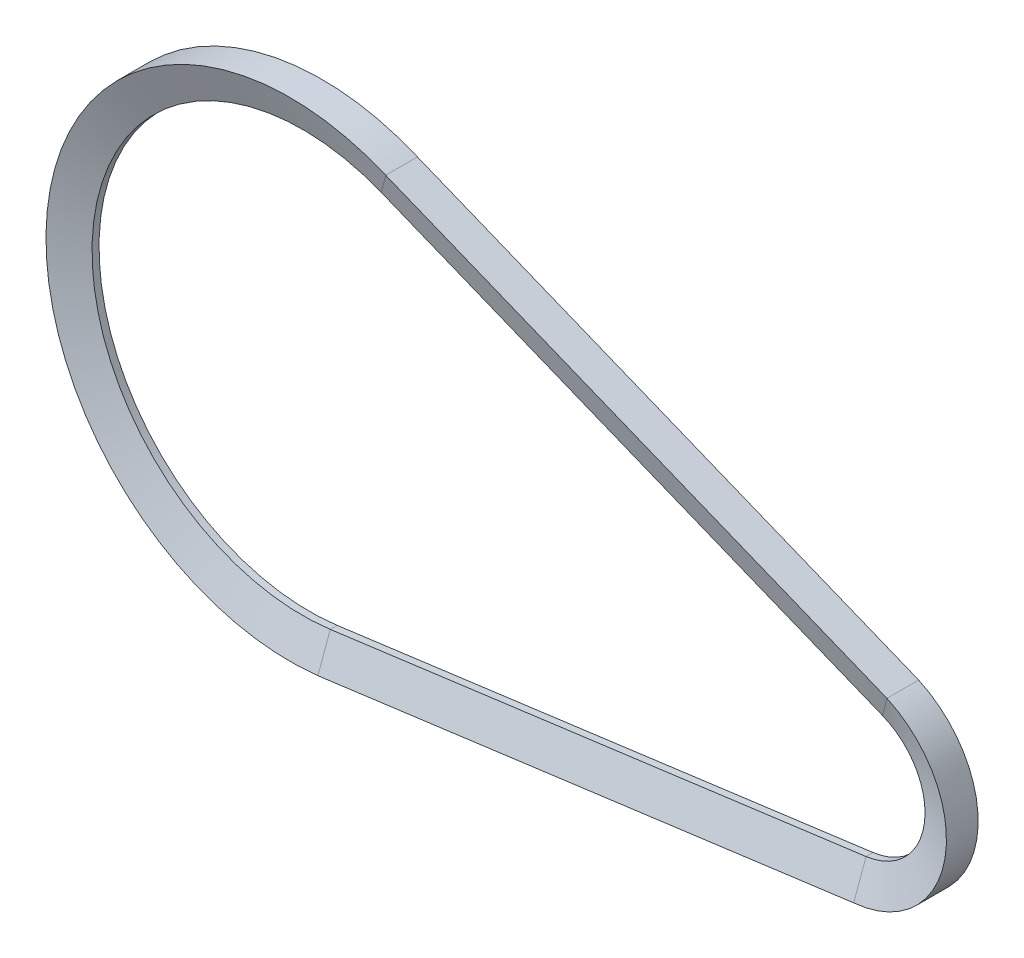
ISO-10303-21;
HEADER;
FILE_DESCRIPTION(('STEP AP214'),'2;1');
FILE_NAME('part.step','',(''),(''),'','','');
FILE_SCHEMA(('AUTOMOTIVE_DESIGN { 1 0 10303 214 1 1 1 1 }'));
ENDSEC;
DATA;
#1=APPLICATION_CONTEXT('core data for automotive mechanical design processes');
#2=APPLICATION_PROTOCOL_DEFINITION('international standard','automotive_design',2000,#1);
#3=PRODUCT_CONTEXT('',#1,'mechanical');
#4=PRODUCT('Part','Part','',(#3));
#5=PRODUCT_RELATED_PRODUCT_CATEGORY('part','',(#4));
#6=PRODUCT_DEFINITION_FORMATION('','',#4);
#7=PRODUCT_DEFINITION_CONTEXT('part definition',#1,'design');
#8=PRODUCT_DEFINITION('design','',#6,#7);
#9=PRODUCT_DEFINITION_SHAPE('','',#8);
#10=(LENGTH_UNIT() NAMED_UNIT(*) SI_UNIT(.MILLI.,.METRE.));
#11=(NAMED_UNIT(*) PLANE_ANGLE_UNIT() SI_UNIT($,.RADIAN.));
#12=(NAMED_UNIT(*) SI_UNIT($,.STERADIAN.) SOLID_ANGLE_UNIT());
#13=UNCERTAINTY_MEASURE_WITH_UNIT(LENGTH_MEASURE(1.E-05),#10,'distance_accuracy_value','');
#14=(GEOMETRIC_REPRESENTATION_CONTEXT(3) GLOBAL_UNCERTAINTY_ASSIGNED_CONTEXT((#13)) GLOBAL_UNIT_ASSIGNED_CONTEXT((#10,
#11,#12)) REPRESENTATION_CONTEXT('',''));
#15=CARTESIAN_POINT('',(0.,0.,0.));
#16=DIRECTION('',(0.,0.,1.));
#17=DIRECTION('',(1.,0.,0.));
#18=AXIS2_PLACEMENT_3D('',#15,#16,#17);
#19=CARTESIAN_POINT('',(124.475719306739,-37.8693151564213,-3.5));
#20=DIRECTION('',(0.131714620449235,-0.991287677094754,0.));
#21=DIRECTION('',(0.991287677094754,0.131714620449235,0.));
#22=AXIS2_PLACEMENT_3D('',#19,#20,#21);
#23=PLANE('',#22);
#24=DIRECTION('',(-0.991287677094754,-0.131714620449235,0.));
#25=VECTOR('',#24,1.);
#26=CARTESIAN_POINT('',(124.475719306739,-37.8693151564213,-3.5));
#27=LINE('',#26,#25);
#28=CARTESIAN_POINT('',(124.475719306739,-37.8693151564213,-3.5));
#29=VERTEX_POINT('',#28);
#30=CARTESIAN_POINT('',(6.12472985088943,-53.5948769849061,-3.5));
#31=VERTEX_POINT('',#30);
#32=EDGE_CURVE('E11',#29,#31,#27,.T.);
#33=ORIENTED_EDGE('',*,*,#32,.F.);
#34=DIRECTION('',(0.,0.,1.));
#35=VECTOR('',#34,1.);
#36=CARTESIAN_POINT('',(124.475719306739,-37.8693151564213,-3.5));
#37=LINE('',#36,#35);
#38=CARTESIAN_POINT('',(124.475719306739,-37.8693151564213,3.5));
#39=VERTEX_POINT('',#38);
#40=EDGE_CURVE('E46',#29,#39,#37,.T.);
#41=ORIENTED_EDGE('',*,*,#40,.T.);
#42=DIRECTION('',(-0.991287677094754,-0.131714620449235,0.));
#43=VECTOR('',#42,1.);
#44=CARTESIAN_POINT('',(124.475719306739,-37.8693151564213,3.5));
#45=LINE('',#44,#43);
#46=CARTESIAN_POINT('',(6.12472985088943,-53.5948769849061,3.5));
#47=VERTEX_POINT('',#46);
#48=EDGE_CURVE('E123',#39,#47,#45,.T.);
#49=ORIENTED_EDGE('',*,*,#48,.T.);
#50=DIRECTION('',(0.,0.,1.));
#51=VECTOR('',#50,1.);
#52=CARTESIAN_POINT('',(6.12472985088944,-53.5948769849061,-3.5));
#53=LINE('',#52,#51);
#54=EDGE_CURVE('E126',#31,#47,#53,.T.);
#55=ORIENTED_EDGE('',*,*,#54,.F.);
#56=EDGE_LOOP('',(#33,#41,#49,#55));
#57=FACE_BOUND('',#56,.T.);
#58=ADVANCED_FACE('F43',(#57),#23,.T.);
#59=CARTESIAN_POINT('',(124.475719306739,-37.8693151564213,-3.5));
#60=DIRECTION('',(-0.0453981297575221,0.341667511459937,-0.938723772697428));
#61=DIRECTION('',(0.,0.939692620785908,0.342020143325669));
#62=AXIS2_PLACEMENT_3D('',#59,#60,#61);
#63=PLANE('',#62);
#64=DIRECTION('',(-0.991287677094754,-0.131714620449235,0.));
#65=VECTOR('',#64,1.);
#66=CARTESIAN_POINT('',(124.475719306739,-30.3693151564213,-0.770223243003475));
#67=LINE('',#66,#65);
#68=CARTESIAN_POINT('',(124.475719306739,-30.3693151564213,-0.770223243003475));
#69=VERTEX_POINT('',#68);
#70=CARTESIAN_POINT('',(6.12472985088944,-46.0948769849061,-0.770223243003475));
#71=VERTEX_POINT('',#70);
#72=EDGE_CURVE('E52',#69,#71,#67,.T.);
#73=ORIENTED_EDGE('',*,*,#72,.F.);
#74=DIRECTION('',(0.,-0.939692620785908,-0.342020143325669));
#75=VECTOR('',#74,1.);
#76=CARTESIAN_POINT('',(124.475719306739,-37.8693151564213,-3.5));
#77=LINE('',#76,#75);
#78=EDGE_CURVE('E216',#69,#29,#77,.T.);
#79=ORIENTED_EDGE('',*,*,#78,.T.);
#80=ORIENTED_EDGE('',*,*,#32,.T.);
#81=DIRECTION('',(0.,-0.939692620785908,-0.342020143325669));
#82=VECTOR('',#81,1.);
#83=CARTESIAN_POINT('',(6.12472985088944,-53.5948769849061,-3.5));
#84=LINE('',#83,#82);
#85=EDGE_CURVE('E153',#71,#31,#84,.T.);
#86=ORIENTED_EDGE('',*,*,#85,.F.);
#87=EDGE_LOOP('',(#73,#79,#80,#86));
#88=FACE_BOUND('',#87,.T.);
#89=ADVANCED_FACE('F265',(#88),#63,.T.);
#90=CARTESIAN_POINT('',(124.475719306739,-30.3693151564213,-0.770223243003475));
#91=DIRECTION('',(-0.131714620449235,0.991287677094754,0.));
#92=DIRECTION('',(-0.991287677094754,-0.131714620449235,0.));
#93=AXIS2_PLACEMENT_3D('',#90,#91,#92);
#94=PLANE('',#93);
#95=DIRECTION('',(-0.991287677094754,-0.131714620449235,0.));
#96=VECTOR('',#95,1.);
#97=CARTESIAN_POINT('',(124.475719306739,-30.3693151564213,0.770223243003475));
#98=LINE('',#97,#96);
#99=CARTESIAN_POINT('',(124.475719306739,-30.3693151564213,0.770223243003475));
#100=VERTEX_POINT('',#99);
#101=CARTESIAN_POINT('',(6.12472985088944,-46.0948769849061,0.770223243003475));
#102=VERTEX_POINT('',#101);
#103=EDGE_CURVE('E133',#100,#102,#98,.T.);
#104=ORIENTED_EDGE('',*,*,#103,.F.);
#105=DIRECTION('',(0.,0.,-1.));
#106=VECTOR('',#105,1.);
#107=CARTESIAN_POINT('',(124.475719306739,-30.3693151564213,-0.770223243003475));
#108=LINE('',#107,#106);
#109=EDGE_CURVE('E189',#100,#69,#108,.T.);
#110=ORIENTED_EDGE('',*,*,#109,.T.);
#111=ORIENTED_EDGE('',*,*,#72,.T.);
#112=DIRECTION('',(0.,0.,-1.));
#113=VECTOR('',#112,1.);
#114=CARTESIAN_POINT('',(6.12472985088944,-46.0948769849061,-0.770223243003475));
#115=LINE('',#114,#113);
#116=EDGE_CURVE('E158',#102,#71,#115,.T.);
#117=ORIENTED_EDGE('',*,*,#116,.F.);
#118=EDGE_LOOP('',(#104,#110,#111,#117));
#119=FACE_BOUND('',#118,.T.);
#120=ADVANCED_FACE('F269',(#119),#94,.T.);
#121=CARTESIAN_POINT('',(122.5,-15.5,0.));
#122=DIRECTION('',(0.,0.,-1.));
#123=DIRECTION('',(-1.,0.,0.));
#124=AXIS2_PLACEMENT_3D('',#121,#122,#123);
#125=CYLINDRICAL_SURFACE('',#124,22.4563961344273);
#126=ORIENTED_EDGE('',*,*,#40,.F.);
#127=CARTESIAN_POINT('',(122.5,-15.5,-3.5));
#128=DIRECTION('',(0.,0.,-1.));
#129=DIRECTION('',(0.414894040337447,0.909869735342631,0.));
#130=AXIS2_PLACEMENT_3D('',#127,#128,#129);
#131=CIRCLE('',#130,22.4563961344273);
#132=CARTESIAN_POINT('',(131.817024923631,4.9323952075806,-3.5));
#133=VERTEX_POINT('',#132);
#134=EDGE_CURVE('E232',#133,#29,#131,.T.);
#135=ORIENTED_EDGE('',*,*,#134,.F.);
#136=DIRECTION('',(0.,0.,1.));
#137=VECTOR('',#136,1.);
#138=CARTESIAN_POINT('',(131.817024923631,4.9323952075806,-3.5));
#139=LINE('',#138,#137);
#140=CARTESIAN_POINT('',(131.817024923631,4.9323952075806,3.5));
#141=VERTEX_POINT('',#140);
#142=EDGE_CURVE('E193',#133,#141,#139,.T.);
#143=ORIENTED_EDGE('',*,*,#142,.T.);
#144=CARTESIAN_POINT('',(122.5,-15.5,3.5));
#145=DIRECTION('',(0.,0.,-1.));
#146=DIRECTION('',(0.414894040337447,0.909869735342631,0.));
#147=AXIS2_PLACEMENT_3D('',#144,#145,#146);
#148=CIRCLE('',#147,22.4563961344273);
#149=EDGE_CURVE('E185',#141,#39,#148,.T.);
#150=ORIENTED_EDGE('',*,*,#149,.T.);
#151=EDGE_LOOP('',(#126,#135,#143,#150));
#152=FACE_BOUND('',#151,.T.);
#153=ADVANCED_FACE('F242',(#152),#125,.T.);
#154=CARTESIAN_POINT('',(128.117006892717,-1.59139713820367,-0.770223243003474));
#155=CARTESIAN_POINT('',(145.926890042233,-8.78394101937952,-0.770223243003474));
#156=CARTESIAN_POINT('',(143.51578882922,-27.8394183480289,-0.770223243003474));
#157=CARTESIAN_POINT('',(124.475719306739,-30.3693151564213,-0.770223243003474));
#158=CARTESIAN_POINT('',(131.817024923631,4.93239520758062,-3.5));
#159=CARTESIAN_POINT('',(157.980585327767,-6.99799973142357,-3.5));
#160=CARTESIAN_POINT('',(153.119494172499,-35.3394183480289,-3.5));
#161=CARTESIAN_POINT('',(124.475719306738,-37.8693151564213,-3.5));
#162=(BOUNDED_SURFACE() B_SPLINE_SURFACE(1,3,((#154,#155,#156,#157),(#158,#159,#160,#161)),
.UNSPECIFIED.,.F.,.F.,.F.) B_SPLINE_SURFACE_WITH_KNOTS((2,2),(4,4),(0.,1.),(0.,1.),
.UNSPECIFIED.) GEOMETRIC_REPRESENTATION_ITEM() RATIONAL_B_SPLINE_SURFACE(((1.,0.503405880312619,
0.503405880312619,1.),(1.,0.503405880312619,0.503405880312619,1.))) REPRESENTATION_ITEM('') SURFACE());
#163=CARTESIAN_POINT('',(122.5,-15.5,-0.770223243003475));
#164=DIRECTION('',(0.,0.,-1.));
#165=DIRECTION('',(0.374467126181138,0.927240190786422,0.));
#166=AXIS2_PLACEMENT_3D('',#163,#164,#165);
#167=CIRCLE('',#166,15.);
#168=CARTESIAN_POINT('',(128.117006892717,-1.59139713820367,-0.770223243003475));
#169=VERTEX_POINT('',#168);
#170=EDGE_CURVE('E212',#169,#69,#167,.T.);
#171=DIRECTION('',(0.463583952056587,0.817381270249743,-0.342020143325669));
#172=VECTOR('',#171,1.);
#173=CARTESIAN_POINT('',(131.817024923631,4.9323952075806,-3.5));
#174=LINE('',#173,#172);
#175=EDGE_CURVE('E206',#169,#133,#174,.T.);
#176=ORIENTED_EDGE('',*,*,#134,.T.);
#177=ORIENTED_EDGE('',*,*,#78,.F.);
#178=ORIENTED_EDGE('',*,*,#170,.F.);
#179=ORIENTED_EDGE('',*,*,#175,.T.);
#180=EDGE_LOOP('',(#176,#177,#178,#179));
#181=FACE_BOUND('',#180,.T.);
#182=ADVANCED_FACE('F278',(#181),#162,.T.);
#183=CARTESIAN_POINT('',(122.5,-15.5,0.));
#184=DIRECTION('',(0.,0.,-1.));
#185=DIRECTION('',(-1.,0.,0.));
#186=AXIS2_PLACEMENT_3D('',#183,#184,#185);
#187=CYLINDRICAL_SURFACE('',#186,15.);
#188=ORIENTED_EDGE('',*,*,#170,.T.);
#189=ORIENTED_EDGE('',*,*,#109,.F.);
#190=CARTESIAN_POINT('',(122.5,-15.5,0.770223243003475));
#191=DIRECTION('',(0.,0.,-1.));
#192=DIRECTION('',(0.374467126181138,0.927240190786422,0.));
#193=AXIS2_PLACEMENT_3D('',#190,#191,#192);
#194=CIRCLE('',#193,15.);
#195=CARTESIAN_POINT('',(128.117006892717,-1.59139713820367,0.770223243003475));
#196=VERTEX_POINT('',#195);
#197=EDGE_CURVE('E184',#196,#100,#194,.T.);
#198=ORIENTED_EDGE('',*,*,#197,.F.);
#199=DIRECTION('',(0.,0.,-1.));
#200=VECTOR('',#199,1.);
#201=CARTESIAN_POINT('',(128.117006892717,-1.59139713820367,-0.770223243003475));
#202=LINE('',#201,#200);
#203=EDGE_CURVE('E174',#196,#169,#202,.T.);
#204=ORIENTED_EDGE('',*,*,#203,.T.);
#205=EDGE_LOOP('',(#188,#189,#198,#204));
#206=FACE_BOUND('',#205,.T.);
#207=ADVANCED_FACE('F250',(#206),#187,.F.);
#208=CARTESIAN_POINT('',(131.817024923631,4.93239520758062,3.5));
#209=CARTESIAN_POINT('',(157.980585327767,-6.99799973142357,3.5));
#210=CARTESIAN_POINT('',(153.119494172499,-35.3394183480289,3.5));
#211=CARTESIAN_POINT('',(124.475719306738,-37.8693151564213,3.5));
#212=CARTESIAN_POINT('',(128.117006892717,-1.59139713820367,0.770223243003476));
#213=CARTESIAN_POINT('',(145.926890042233,-8.78394101937952,0.770223243003476));
#214=CARTESIAN_POINT('',(143.51578882922,-27.8394183480289,0.770223243003476));
#215=CARTESIAN_POINT('',(124.475719306739,-30.3693151564213,0.770223243003476));
#216=(BOUNDED_SURFACE() B_SPLINE_SURFACE(1,3,((#208,#209,#210,#211),(#212,#213,#214,#215)),
.UNSPECIFIED.,.F.,.F.,.F.) B_SPLINE_SURFACE_WITH_KNOTS((2,2),(4,4),(0.,1.),(0.,1.),
.UNSPECIFIED.) GEOMETRIC_REPRESENTATION_ITEM() RATIONAL_B_SPLINE_SURFACE(((1.,0.503405880312619,
0.503405880312619,1.),(1.,0.503405880312619,0.503405880312619,1.))) REPRESENTATION_ITEM('') SURFACE());
#217=DIRECTION('',(0.,0.939692620785908,-0.34202014332567));
#218=VECTOR('',#217,1.);
#219=CARTESIAN_POINT('',(124.475719306739,-37.8693151564213,3.5));
#220=LINE('',#219,#218);
#221=EDGE_CURVE('E181',#39,#100,#220,.T.);
#222=DIRECTION('',(-0.463583952056587,-0.817381270249743,-0.34202014332567));
#223=VECTOR('',#222,1.);
#224=CARTESIAN_POINT('',(131.817024923631,4.9323952075806,3.5));
#225=LINE('',#224,#223);
#226=EDGE_CURVE('E170',#141,#196,#225,.T.);
#227=ORIENTED_EDGE('',*,*,#197,.T.);
#228=ORIENTED_EDGE('',*,*,#221,.F.);
#229=ORIENTED_EDGE('',*,*,#149,.F.);
#230=ORIENTED_EDGE('',*,*,#226,.T.);
#231=EDGE_LOOP('',(#227,#228,#229,#230));
#232=FACE_BOUND('',#231,.T.);
#233=ADVANCED_FACE('F247',(#232),#216,.T.);
#234=CARTESIAN_POINT('',(21.1127393983366,49.6404612173529,-3.5));
#235=DIRECTION('',(0.374467126181139,0.927240190786421,0.));
#236=DIRECTION('',(-0.927240190786422,0.374467126181139,0.));
#237=AXIS2_PLACEMENT_3D('',#234,#235,#236);
#238=PLANE('',#237);
#239=ORIENTED_EDGE('',*,*,#142,.F.);
#240=DIRECTION('',(0.927240190786421,-0.374467126181139,0.));
#241=VECTOR('',#240,1.);
#242=CARTESIAN_POINT('',(21.1127393983366,49.6404612173529,-3.5));
#243=LINE('',#242,#241);
#244=CARTESIAN_POINT('',(21.1127393983366,49.6404612173529,-3.5));
#245=VERTEX_POINT('',#244);
#246=EDGE_CURVE('E88',#245,#133,#243,.T.);
#247=ORIENTED_EDGE('',*,*,#246,.F.);
#248=DIRECTION('',(0.,0.,1.));
#249=VECTOR('',#248,1.);
#250=CARTESIAN_POINT('',(21.1127393983366,49.6404612173529,-3.5));
#251=LINE('',#250,#249);
#252=CARTESIAN_POINT('',(21.1127393983366,49.6404612173529,3.5));
#253=VERTEX_POINT('',#252);
#254=EDGE_CURVE('E180',#245,#253,#251,.T.);
#255=ORIENTED_EDGE('',*,*,#254,.T.);
#256=DIRECTION('',(0.927240190786421,-0.374467126181139,0.));
#257=VECTOR('',#256,1.);
#258=CARTESIAN_POINT('',(21.1127393983366,49.6404612173529,3.5));
#259=LINE('',#258,#257);
#260=EDGE_CURVE('E177',#253,#141,#259,.T.);
#261=ORIENTED_EDGE('',*,*,#260,.T.);
#262=EDGE_LOOP('',(#239,#247,#255,#261));
#263=FACE_BOUND('',#262,.T.);
#264=ADVANCED_FACE('F260',(#263),#238,.T.);
#265=CARTESIAN_POINT('',(21.1127393983366,49.6404612173529,-3.5));
#266=DIRECTION('',(-0.129067730873885,-0.319592239298412,-0.938723772697428));
#267=DIRECTION('',(0.,0.946641691748173,-0.322287926308383));
#268=AXIS2_PLACEMENT_3D('',#265,#266,#267);
#269=PLANE('',#268);
#270=ORIENTED_EDGE('',*,*,#246,.T.);
#271=ORIENTED_EDGE('',*,*,#175,.F.);
#272=DIRECTION('',(0.927240190786421,-0.374467126181139,0.));
#273=VECTOR('',#272,1.);
#274=CARTESIAN_POINT('',(17.4127213674229,43.1166688715686,-0.770223243003475));
#275=LINE('',#274,#273);
#276=CARTESIAN_POINT('',(17.4127213674229,43.1166688715686,-0.770223243003475));
#277=VERTEX_POINT('',#276);
#278=EDGE_CURVE('E98',#277,#169,#275,.T.);
#279=ORIENTED_EDGE('',*,*,#278,.F.);
#280=DIRECTION('',(0.463583952056587,0.817381270249743,-0.342020143325669));
#281=VECTOR('',#280,1.);
#282=CARTESIAN_POINT('',(21.1127393983366,49.6404612173529,-3.5));
#283=LINE('',#282,#281);
#284=EDGE_CURVE('E202',#277,#245,#283,.T.);
#285=ORIENTED_EDGE('',*,*,#284,.T.);
#286=EDGE_LOOP('',(#270,#271,#279,#285));
#287=FACE_BOUND('',#286,.T.);
#288=ADVANCED_FACE('F253',(#287),#269,.T.);
#289=CARTESIAN_POINT('',(17.4127213674229,43.1166688715686,-0.770223243003475));
#290=DIRECTION('',(-0.374467126181139,-0.927240190786421,0.));
#291=DIRECTION('',(0.927240190786422,-0.374467126181139,0.));
#292=AXIS2_PLACEMENT_3D('',#289,#290,#291);
#293=PLANE('',#292);
#294=ORIENTED_EDGE('',*,*,#278,.T.);
#295=ORIENTED_EDGE('',*,*,#203,.F.);
#296=DIRECTION('',(0.927240190786421,-0.374467126181139,0.));
#297=VECTOR('',#296,1.);
#298=CARTESIAN_POINT('',(17.4127213674229,43.1166688715686,0.770223243003475));
#299=LINE('',#298,#297);
#300=CARTESIAN_POINT('',(17.4127213674229,43.1166688715686,0.770223243003475));
#301=VERTEX_POINT('',#300);
#302=EDGE_CURVE('E106',#301,#196,#299,.T.);
#303=ORIENTED_EDGE('',*,*,#302,.F.);
#304=DIRECTION('',(0.,0.,-1.));
#305=VECTOR('',#304,1.);
#306=CARTESIAN_POINT('',(17.4127213674229,43.1166688715686,-0.770223243003475));
#307=LINE('',#306,#305);
#308=EDGE_CURVE('E168',#301,#277,#307,.T.);
#309=ORIENTED_EDGE('',*,*,#308,.T.);
#310=EDGE_LOOP('',(#294,#295,#303,#309));
#311=FACE_BOUND('',#310,.T.);
#312=ADVANCED_FACE('F251',(#311),#293,.T.);
#313=CARTESIAN_POINT('',(21.1127393983366,49.6404612173529,3.5));
#314=DIRECTION('',(-0.129067730873885,-0.319592239298412,0.938723772697428));
#315=DIRECTION('',(0.,-0.946641691748173,-0.322287926308383));
#316=AXIS2_PLACEMENT_3D('',#313,#314,#315);
#317=PLANE('',#316);
#318=ORIENTED_EDGE('',*,*,#302,.T.);
#319=ORIENTED_EDGE('',*,*,#226,.F.);
#320=ORIENTED_EDGE('',*,*,#260,.F.);
#321=DIRECTION('',(-0.463583952056587,-0.817381270249743,-0.34202014332567));
#322=VECTOR('',#321,1.);
#323=CARTESIAN_POINT('',(21.1127393983366,49.6404612173529,3.5));
#324=LINE('',#323,#322);
#325=EDGE_CURVE('E143',#253,#301,#324,.T.);
#326=ORIENTED_EDGE('',*,*,#325,.T.);
#327=EDGE_LOOP('',(#318,#319,#320,#326));
#328=FACE_BOUND('',#327,.T.);
#329=ADVANCED_FACE('F245',(#328),#317,.T.);
#330=CARTESIAN_POINT('',(0.,0.,0.));
#331=DIRECTION('',(0.,0.,-1.));
#332=DIRECTION('',(-1.,0.,0.));
#333=AXIS2_PLACEMENT_3D('',#330,#331,#332);
#334=CYLINDRICAL_SURFACE('',#333,53.94370356931);
#335=ORIENTED_EDGE('',*,*,#254,.F.);
#336=CARTESIAN_POINT('',(0.,0.,-3.5));
#337=DIRECTION('',(0.,0.,-1.));
#338=DIRECTION('',(0.113539290883505,-0.993533506946631,0.));
#339=AXIS2_PLACEMENT_3D('',#336,#337,#338);
#340=CIRCLE('',#339,53.94370356931);
#341=EDGE_CURVE('E151',#31,#245,#340,.T.);
#342=ORIENTED_EDGE('',*,*,#341,.F.);
#343=ORIENTED_EDGE('',*,*,#54,.T.);
#344=CARTESIAN_POINT('',(0.,0.,3.5));
#345=DIRECTION('',(0.,0.,-1.));
#346=DIRECTION('',(0.113539290883505,-0.993533506946631,0.));
#347=AXIS2_PLACEMENT_3D('',#344,#345,#346);
#348=CIRCLE('',#347,53.94370356931);
#349=EDGE_CURVE('E139',#47,#253,#348,.T.);
#350=ORIENTED_EDGE('',*,*,#349,.T.);
#351=EDGE_LOOP('',(#335,#342,#343,#350));
#352=FACE_BOUND('',#351,.T.);
#353=ADVANCED_FACE('F149',(#352),#334,.T.);
#354=CARTESIAN_POINT('',(6.12472985088944,-46.0948769849061,-0.770223243003474));
#355=CARTESIAN_POINT('',(-26.763809279918,-50.4648510588701,-0.770223243003474));
#356=CARTESIAN_POINT('',(-50.2969528979131,-27.0780207687135,-0.770223243003474));
#357=CARTESIAN_POINT('',(-46.1321783681313,5.83713277311048,-0.770223243003474));
#358=CARTESIAN_POINT('',(-41.9674038383495,38.7522863149345,-0.770223243003474));
#359=CARTESIAN_POINT('',(-13.3508763277611,55.5405867888213,-0.770223243003474));
#360=CARTESIAN_POINT('',(17.412721367423,43.1166688715686,-0.770223243003474));
#361=CARTESIAN_POINT('',(6.12472985088944,-53.5948769849061,-3.5));
#362=CARTESIAN_POINT('',(-32.1150339629088,-57.9648510588701,-3.5));
#363=CARTESIAN_POINT('',(-58.9139401287492,-30.3388698408813,-3.5));
#364=CARTESIAN_POINT('',(-53.3840209820254,7.75044892662745,-3.5));
#365=CARTESIAN_POINT('',(-47.8541018353016,45.8397676941361,-3.5));
#366=CARTESIAN_POINT('',(-14.3055621138431,64.7043295098772,-3.5));
#367=CARTESIAN_POINT('',(21.1127393983366,49.6404612173529,-3.5));
#368=(BOUNDED_SURFACE() B_SPLINE_SURFACE(1,3,((#354,#355,#356,#357,#358,#359,#360),(#361,#362,
#363,#364,#365,#366,#367)),.UNSPECIFIED.,.F.,.F.,.F.) B_SPLINE_SURFACE_WITH_KNOTS((2,2),(4,3,4),
(0.,1.),(0.,0.5,1.),
.UNSPECIFIED.) GEOMETRIC_REPRESENTATION_ITEM() RATIONAL_B_SPLINE_SURFACE(((1.,0.740188803038642,
0.740188803038642,1.,0.740188803038642,0.740188803038642,1.),(1.,0.740188803038642,
0.740188803038642,1.,0.740188803038642,0.740188803038642,1.))) REPRESENTATION_ITEM('') SURFACE());
#369=CARTESIAN_POINT('',(0.,0.,-0.770223243003475));
#370=DIRECTION('',(0.,0.,-1.));
#371=DIRECTION('',(0.131714620449235,-0.991287677094754,0.));
#372=AXIS2_PLACEMENT_3D('',#369,#370,#371);
#373=CIRCLE('',#372,46.5);
#374=EDGE_CURVE('E198',#71,#277,#373,.T.);
#375=ORIENTED_EDGE('',*,*,#341,.T.);
#376=ORIENTED_EDGE('',*,*,#284,.F.);
#377=ORIENTED_EDGE('',*,*,#374,.F.);
#378=ORIENTED_EDGE('',*,*,#85,.T.);
#379=EDGE_LOOP('',(#375,#376,#377,#378));
#380=FACE_BOUND('',#379,.T.);
#381=ADVANCED_FACE('F283',(#380),#368,.T.);
#382=CARTESIAN_POINT('',(0.,0.,0.));
#383=DIRECTION('',(0.,0.,-1.));
#384=DIRECTION('',(-1.,0.,0.));
#385=AXIS2_PLACEMENT_3D('',#382,#383,#384);
#386=CYLINDRICAL_SURFACE('',#385,46.5);
#387=ORIENTED_EDGE('',*,*,#374,.T.);
#388=ORIENTED_EDGE('',*,*,#308,.F.);
#389=CARTESIAN_POINT('',(0.,0.,0.770223243003475));
#390=DIRECTION('',(0.,0.,-1.));
#391=DIRECTION('',(0.131714620449235,-0.991287677094754,0.));
#392=AXIS2_PLACEMENT_3D('',#389,#390,#391);
#393=CIRCLE('',#392,46.5);
#394=EDGE_CURVE('E166',#102,#301,#393,.T.);
#395=ORIENTED_EDGE('',*,*,#394,.F.);
#396=ORIENTED_EDGE('',*,*,#116,.T.);
#397=EDGE_LOOP('',(#387,#388,#395,#396));
#398=FACE_BOUND('',#397,.T.);
#399=ADVANCED_FACE('F297',(#398),#386,.F.);
#400=CARTESIAN_POINT('',(6.12472985088944,-53.5948769849061,3.5));
#401=CARTESIAN_POINT('',(-32.1150339629088,-57.9648510588701,3.5));
#402=CARTESIAN_POINT('',(-58.9139401287492,-30.3388698408813,3.5));
#403=CARTESIAN_POINT('',(-53.3840209820254,7.75044892662745,3.5));
#404=CARTESIAN_POINT('',(-47.8541018353016,45.8397676941361,3.5));
#405=CARTESIAN_POINT('',(-14.3055621138431,64.7043295098772,3.5));
#406=CARTESIAN_POINT('',(21.1127393983366,49.6404612173529,3.5));
#407=CARTESIAN_POINT('',(6.12472985088944,-46.0948769849061,0.770223243003476));
#408=CARTESIAN_POINT('',(-26.763809279918,-50.4648510588701,0.770223243003476));
#409=CARTESIAN_POINT('',(-50.2969528979131,-27.0780207687135,0.770223243003476));
#410=CARTESIAN_POINT('',(-46.1321783681313,5.83713277311048,0.770223243003476));
#411=CARTESIAN_POINT('',(-41.9674038383495,38.7522863149345,0.770223243003476));
#412=CARTESIAN_POINT('',(-13.3508763277611,55.5405867888213,0.770223243003476));
#413=CARTESIAN_POINT('',(17.412721367423,43.1166688715686,0.770223243003476));
#414=(BOUNDED_SURFACE() B_SPLINE_SURFACE(1,3,((#400,#401,#402,#403,#404,#405,#406),(#407,#408,
#409,#410,#411,#412,#413)),.UNSPECIFIED.,.F.,.F.,.F.) B_SPLINE_SURFACE_WITH_KNOTS((2,2),(4,3,4),
(0.,1.),(0.,0.5,1.),
.UNSPECIFIED.) GEOMETRIC_REPRESENTATION_ITEM() RATIONAL_B_SPLINE_SURFACE(((1.,0.740188803038642,
0.740188803038642,1.,0.740188803038642,0.740188803038642,1.),(1.,0.740188803038642,
0.740188803038642,1.,0.740188803038642,0.740188803038642,1.))) REPRESENTATION_ITEM('') SURFACE());
#415=DIRECTION('',(0.,0.939692620785908,-0.34202014332567));
#416=VECTOR('',#415,1.);
#417=CARTESIAN_POINT('',(6.12472985088944,-53.5948769849061,3.5));
#418=LINE('',#417,#416);
#419=EDGE_CURVE('E142',#47,#102,#418,.T.);
#420=ORIENTED_EDGE('',*,*,#394,.T.);
#421=ORIENTED_EDGE('',*,*,#325,.F.);
#422=ORIENTED_EDGE('',*,*,#349,.F.);
#423=ORIENTED_EDGE('',*,*,#419,.T.);
#424=EDGE_LOOP('',(#420,#421,#422,#423));
#425=FACE_BOUND('',#424,.T.);
#426=ADVANCED_FACE('F141',(#425),#414,.T.);
#427=CARTESIAN_POINT('',(124.475719306739,-37.8693151564213,3.5));
#428=DIRECTION('',(-0.0453981297575221,0.341667511459937,0.938723772697428));
#429=DIRECTION('',(0.,-0.939692620785908,0.34202014332567));
#430=AXIS2_PLACEMENT_3D('',#427,#428,#429);
#431=PLANE('',#430);
#432=ORIENTED_EDGE('',*,*,#221,.T.);
#433=ORIENTED_EDGE('',*,*,#103,.T.);
#434=ORIENTED_EDGE('',*,*,#419,.F.);
#435=ORIENTED_EDGE('',*,*,#48,.F.);
#436=EDGE_LOOP('',(#432,#433,#434,#435));
#437=FACE_BOUND('',#436,.T.);
#438=ADVANCED_FACE('F155',(#437),#431,.T.);
#439=CLOSED_SHELL('',(#58,#89,#120,#153,#182,#207,#233,#264,#288,#312,#329,#353,#381,#399,#426,#438));
#440=MANIFOLD_SOLID_BREP('B2',#439);
#441=ADVANCED_BREP_SHAPE_REPRESENTATION('',(#18,#440),#14);
#442=SHAPE_DEFINITION_REPRESENTATION(#9,#441);
ENDSEC;
END-ISO-10303-21;
